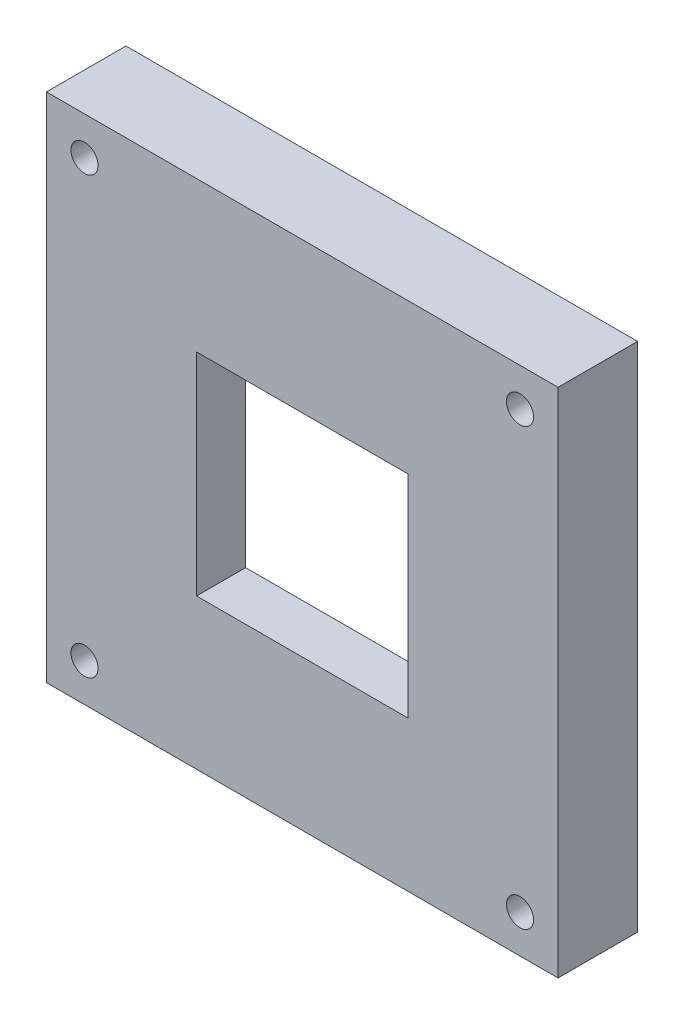
ISO-10303-21;
HEADER;
FILE_DESCRIPTION(('STEP AP214'),'2;1');
FILE_NAME('part.step','',(''),(''),'','','');
FILE_SCHEMA(('AUTOMOTIVE_DESIGN { 1 0 10303 214 1 1 1 1 }'));
ENDSEC;
DATA;
#1=APPLICATION_CONTEXT('core data for automotive mechanical design processes');
#2=APPLICATION_PROTOCOL_DEFINITION('international standard','automotive_design',2000,#1);
#3=PRODUCT_CONTEXT('',#1,'mechanical');
#4=PRODUCT('Part','Part','',(#3));
#5=PRODUCT_RELATED_PRODUCT_CATEGORY('part','',(#4));
#6=PRODUCT_DEFINITION_FORMATION('','',#4);
#7=PRODUCT_DEFINITION_CONTEXT('part definition',#1,'design');
#8=PRODUCT_DEFINITION('design','',#6,#7);
#9=PRODUCT_DEFINITION_SHAPE('','',#8);
#10=(LENGTH_UNIT() NAMED_UNIT(*) SI_UNIT(.MILLI.,.METRE.));
#11=(NAMED_UNIT(*) PLANE_ANGLE_UNIT() SI_UNIT($,.RADIAN.));
#12=(NAMED_UNIT(*) SI_UNIT($,.STERADIAN.) SOLID_ANGLE_UNIT());
#13=UNCERTAINTY_MEASURE_WITH_UNIT(LENGTH_MEASURE(1.E-05),#10,'distance_accuracy_value','');
#14=(GEOMETRIC_REPRESENTATION_CONTEXT(3) GLOBAL_UNCERTAINTY_ASSIGNED_CONTEXT((#13)) GLOBAL_UNIT_ASSIGNED_CONTEXT((#10,
#11,#12)) REPRESENTATION_CONTEXT('',''));
#15=CARTESIAN_POINT('',(0.,0.,0.));
#16=DIRECTION('',(0.,0.,1.));
#17=DIRECTION('',(1.,0.,0.));
#18=AXIS2_PLACEMENT_3D('',#15,#16,#17);
#19=CARTESIAN_POINT('',(0.,0.,-2.4));
#20=DIRECTION('',(0.,0.,-1.));
#21=DIRECTION('',(-1.,0.,0.));
#22=AXIS2_PLACEMENT_3D('',#19,#20,#21);
#23=PLANE('',#22);
#24=DIRECTION('',(0.,1.,0.));
#25=VECTOR('',#24,1.);
#26=CARTESIAN_POINT('',(19.25,-19.25,-2.4));
#27=LINE('',#26,#25);
#28=CARTESIAN_POINT('',(19.25,-19.25,-2.4));
#29=VERTEX_POINT('',#28);
#30=CARTESIAN_POINT('',(19.25,19.25,-2.4));
#31=VERTEX_POINT('',#30);
#32=EDGE_CURVE('E401',#29,#31,#27,.T.);
#33=ORIENTED_EDGE('',*,*,#32,.T.);
#34=DIRECTION('',(-1.,0.,0.));
#35=VECTOR('',#34,1.);
#36=CARTESIAN_POINT('',(-19.25,19.25,-2.4));
#37=LINE('',#36,#35);
#38=CARTESIAN_POINT('',(-19.25,19.25,-2.4));
#39=VERTEX_POINT('',#38);
#40=EDGE_CURVE('E404',#31,#39,#37,.T.);
#41=ORIENTED_EDGE('',*,*,#40,.T.);
#42=DIRECTION('',(0.,-1.,0.));
#43=VECTOR('',#42,1.);
#44=CARTESIAN_POINT('',(-19.25,-19.25,-2.4));
#45=LINE('',#44,#43);
#46=CARTESIAN_POINT('',(-19.25,-19.25,-2.4));
#47=VERTEX_POINT('',#46);
#48=EDGE_CURVE('E407',#39,#47,#45,.T.);
#49=ORIENTED_EDGE('',*,*,#48,.T.);
#50=DIRECTION('',(1.,0.,0.));
#51=VECTOR('',#50,1.);
#52=CARTESIAN_POINT('',(-19.25,-19.25,-2.4));
#53=LINE('',#52,#51);
#54=EDGE_CURVE('E410',#47,#29,#53,.T.);
#55=ORIENTED_EDGE('',*,*,#54,.T.);
#56=EDGE_LOOP('',(#33,#41,#49,#55));
#57=FACE_BOUND('',#56,.T.);
#58=DIRECTION('',(0.,1.,0.));
#59=VECTOR('',#58,1.);
#60=CARTESIAN_POINT('',(20.75,0.,-2.4));
#61=LINE('',#60,#59);
#62=CARTESIAN_POINT('',(20.75,-19.25,-2.4));
#63=VERTEX_POINT('',#62);
#64=CARTESIAN_POINT('',(20.75,19.25,-2.4));
#65=VERTEX_POINT('',#64);
#66=EDGE_CURVE('E58',#63,#65,#61,.T.);
#67=ORIENTED_EDGE('',*,*,#66,.F.);
#68=CARTESIAN_POINT('',(19.25,-19.25,-2.4));
#69=DIRECTION('',(0.,0.,-1.));
#70=DIRECTION('',(-1.,0.,0.));
#71=AXIS2_PLACEMENT_3D('',#68,#69,#70);
#72=CIRCLE('',#71,1.5);
#73=CARTESIAN_POINT('',(19.25,-20.75,-2.4));
#74=VERTEX_POINT('',#73);
#75=EDGE_CURVE('E242',#74,#63,#72,.F.);
#76=ORIENTED_EDGE('',*,*,#75,.F.);
#77=DIRECTION('',(1.,0.,0.));
#78=VECTOR('',#77,1.);
#79=CARTESIAN_POINT('',(0.,-20.75,-2.4));
#80=LINE('',#79,#78);
#81=CARTESIAN_POINT('',(-19.25,-20.75,-2.4));
#82=VERTEX_POINT('',#81);
#83=EDGE_CURVE('E245',#82,#74,#80,.T.);
#84=ORIENTED_EDGE('',*,*,#83,.F.);
#85=CARTESIAN_POINT('',(-19.25,-19.25,-2.4));
#86=DIRECTION('',(0.,0.,-1.));
#87=DIRECTION('',(-1.,0.,0.));
#88=AXIS2_PLACEMENT_3D('',#85,#86,#87);
#89=CIRCLE('',#88,1.5);
#90=CARTESIAN_POINT('',(-20.75,-19.25,-2.4));
#91=VERTEX_POINT('',#90);
#92=EDGE_CURVE('E318',#91,#82,#89,.F.);
#93=ORIENTED_EDGE('',*,*,#92,.F.);
#94=DIRECTION('',(0.,-1.,0.));
#95=VECTOR('',#94,1.);
#96=CARTESIAN_POINT('',(-20.75,0.,-2.4));
#97=LINE('',#96,#95);
#98=CARTESIAN_POINT('',(-20.75,19.25,-2.4));
#99=VERTEX_POINT('',#98);
#100=EDGE_CURVE('E315',#99,#91,#97,.T.);
#101=ORIENTED_EDGE('',*,*,#100,.F.);
#102=CARTESIAN_POINT('',(-19.25,19.25,-2.4));
#103=DIRECTION('',(0.,0.,-1.));
#104=DIRECTION('',(-1.,0.,0.));
#105=AXIS2_PLACEMENT_3D('',#102,#103,#104);
#106=CIRCLE('',#105,1.5);
#107=CARTESIAN_POINT('',(-19.25,20.75,-2.4));
#108=VERTEX_POINT('',#107);
#109=EDGE_CURVE('E312',#108,#99,#106,.F.);
#110=ORIENTED_EDGE('',*,*,#109,.F.);
#111=DIRECTION('',(-1.,0.,0.));
#112=VECTOR('',#111,1.);
#113=CARTESIAN_POINT('',(0.,20.75,-2.4));
#114=LINE('',#113,#112);
#115=CARTESIAN_POINT('',(19.25,20.75,-2.4));
#116=VERTEX_POINT('',#115);
#117=EDGE_CURVE('E309',#116,#108,#114,.T.);
#118=ORIENTED_EDGE('',*,*,#117,.F.);
#119=CARTESIAN_POINT('',(19.25,19.25,-2.4));
#120=DIRECTION('',(0.,0.,-1.));
#121=DIRECTION('',(-1.,0.,0.));
#122=AXIS2_PLACEMENT_3D('',#119,#120,#121);
#123=CIRCLE('',#122,1.5);
#124=EDGE_CURVE('E306',#65,#116,#123,.F.);
#125=ORIENTED_EDGE('',*,*,#124,.F.);
#126=EDGE_LOOP('',(#67,#76,#84,#93,#101,#110,#118,#125));
#127=FACE_BOUND('',#126,.T.);
#128=ADVANCED_FACE('F33',(#57,#127),#23,.T.);
#129=CARTESIAN_POINT('',(19.25,-19.25,-2.4));
#130=DIRECTION('',(1.,0.,0.));
#131=DIRECTION('',(0.,0.,-1.));
#132=AXIS2_PLACEMENT_3D('',#129,#130,#131);
#133=PLANE('',#132);
#134=DIRECTION('',(0.,1.,0.));
#135=VECTOR('',#134,1.);
#136=CARTESIAN_POINT('',(19.25,-19.25,1.2));
#137=LINE('',#136,#135);
#138=CARTESIAN_POINT('',(19.25,-19.25,1.2));
#139=VERTEX_POINT('',#138);
#140=CARTESIAN_POINT('',(19.25,19.25,1.2));
#141=VERTEX_POINT('',#140);
#142=EDGE_CURVE('E353',#139,#141,#137,.T.);
#143=ORIENTED_EDGE('',*,*,#142,.T.);
#144=DIRECTION('',(0.,0.,1.));
#145=VECTOR('',#144,1.);
#146=CARTESIAN_POINT('',(19.25,19.25,-2.4));
#147=LINE('',#146,#145);
#148=EDGE_CURVE('E413',#31,#141,#147,.T.);
#149=ORIENTED_EDGE('',*,*,#148,.F.);
#150=ORIENTED_EDGE('',*,*,#32,.F.);
#151=DIRECTION('',(0.,0.,1.));
#152=VECTOR('',#151,1.);
#153=CARTESIAN_POINT('',(19.25,-19.25,-2.4));
#154=LINE('',#153,#152);
#155=EDGE_CURVE('E414',#29,#139,#154,.T.);
#156=ORIENTED_EDGE('',*,*,#155,.T.);
#157=EDGE_LOOP('',(#143,#149,#150,#156));
#158=FACE_BOUND('',#157,.T.);
#159=ADVANCED_FACE('F465',(#158),#133,.F.);
#160=CARTESIAN_POINT('',(-19.25,-19.25,-2.4));
#161=DIRECTION('',(0.,-1.,0.));
#162=DIRECTION('',(0.,0.,-1.));
#163=AXIS2_PLACEMENT_3D('',#160,#161,#162);
#164=PLANE('',#163);
#165=DIRECTION('',(1.,0.,0.));
#166=VECTOR('',#165,1.);
#167=CARTESIAN_POINT('',(-19.25,-19.25,1.2));
#168=LINE('',#167,#166);
#169=CARTESIAN_POINT('',(-19.25,-19.25,1.2));
#170=VERTEX_POINT('',#169);
#171=EDGE_CURVE('E357',#170,#139,#168,.T.);
#172=ORIENTED_EDGE('',*,*,#171,.T.);
#173=ORIENTED_EDGE('',*,*,#155,.F.);
#174=ORIENTED_EDGE('',*,*,#54,.F.);
#175=DIRECTION('',(0.,0.,1.));
#176=VECTOR('',#175,1.);
#177=CARTESIAN_POINT('',(-19.25,-19.25,-2.4));
#178=LINE('',#177,#176);
#179=EDGE_CURVE('E418',#47,#170,#178,.T.);
#180=ORIENTED_EDGE('',*,*,#179,.T.);
#181=EDGE_LOOP('',(#172,#173,#174,#180));
#182=FACE_BOUND('',#181,.T.);
#183=ADVANCED_FACE('F471',(#182),#164,.F.);
#184=CARTESIAN_POINT('',(-19.25,-19.25,-2.4));
#185=DIRECTION('',(-1.,0.,0.));
#186=DIRECTION('',(0.,0.,1.));
#187=AXIS2_PLACEMENT_3D('',#184,#185,#186);
#188=PLANE('',#187);
#189=DIRECTION('',(0.,-1.,0.));
#190=VECTOR('',#189,1.);
#191=CARTESIAN_POINT('',(-19.25,19.25,1.2));
#192=LINE('',#191,#190);
#193=CARTESIAN_POINT('',(-19.25,19.25,1.2));
#194=VERTEX_POINT('',#193);
#195=EDGE_CURVE('E359',#194,#170,#192,.T.);
#196=ORIENTED_EDGE('',*,*,#195,.T.);
#197=ORIENTED_EDGE('',*,*,#179,.F.);
#198=ORIENTED_EDGE('',*,*,#48,.F.);
#199=DIRECTION('',(0.,0.,1.));
#200=VECTOR('',#199,1.);
#201=CARTESIAN_POINT('',(-19.25,19.25,-2.4));
#202=LINE('',#201,#200);
#203=EDGE_CURVE('E421',#39,#194,#202,.T.);
#204=ORIENTED_EDGE('',*,*,#203,.T.);
#205=EDGE_LOOP('',(#196,#197,#198,#204));
#206=FACE_BOUND('',#205,.T.);
#207=ADVANCED_FACE('F568',(#206),#188,.F.);
#208=CARTESIAN_POINT('',(-19.25,19.25,-2.4));
#209=DIRECTION('',(0.,1.,0.));
#210=DIRECTION('',(0.,0.,1.));
#211=AXIS2_PLACEMENT_3D('',#208,#209,#210);
#212=PLANE('',#211);
#213=DIRECTION('',(-1.,0.,0.));
#214=VECTOR('',#213,1.);
#215=CARTESIAN_POINT('',(19.25,19.25,1.2));
#216=LINE('',#215,#214);
#217=EDGE_CURVE('E361',#141,#194,#216,.T.);
#218=ORIENTED_EDGE('',*,*,#217,.T.);
#219=ORIENTED_EDGE('',*,*,#203,.F.);
#220=ORIENTED_EDGE('',*,*,#40,.F.);
#221=ORIENTED_EDGE('',*,*,#148,.T.);
#222=EDGE_LOOP('',(#218,#219,#220,#221));
#223=FACE_BOUND('',#222,.T.);
#224=ADVANCED_FACE('F572',(#223),#212,.F.);
#225=CARTESIAN_POINT('',(-30.25,-30.25,-2.4));
#226=DIRECTION('',(-1.,0.,0.));
#227=DIRECTION('',(0.,0.,1.));
#228=AXIS2_PLACEMENT_3D('',#225,#226,#227);
#229=PLANE('',#228);
#230=DIRECTION('',(0.,0.,1.));
#231=VECTOR('',#230,1.);
#232=CARTESIAN_POINT('',(-30.25,-30.25,-2.4));
#233=LINE('',#232,#231);
#234=CARTESIAN_POINT('',(-30.25,-30.25,-2.4));
#235=VERTEX_POINT('',#234);
#236=CARTESIAN_POINT('',(-30.25,-30.25,7.));
#237=VERTEX_POINT('',#236);
#238=EDGE_CURVE('E37',#235,#237,#233,.T.);
#239=ORIENTED_EDGE('',*,*,#238,.T.);
#240=DIRECTION('',(0.,-1.,0.));
#241=VECTOR('',#240,1.);
#242=CARTESIAN_POINT('',(-30.25,-30.25,7.));
#243=LINE('',#242,#241);
#244=CARTESIAN_POINT('',(-30.25,30.25,7.));
#245=VERTEX_POINT('',#244);
#246=EDGE_CURVE('E388',#245,#237,#243,.T.);
#247=ORIENTED_EDGE('',*,*,#246,.F.);
#248=DIRECTION('',(0.,0.,1.));
#249=VECTOR('',#248,1.);
#250=CARTESIAN_POINT('',(-30.25,30.25,-2.4));
#251=LINE('',#250,#249);
#252=CARTESIAN_POINT('',(-30.25,30.25,-2.4));
#253=VERTEX_POINT('',#252);
#254=EDGE_CURVE('E11',#253,#245,#251,.T.);
#255=ORIENTED_EDGE('',*,*,#254,.F.);
#256=DIRECTION('',(0.,-1.,0.));
#257=VECTOR('',#256,1.);
#258=CARTESIAN_POINT('',(-30.25,-30.25,-2.4));
#259=LINE('',#258,#257);
#260=EDGE_CURVE('E417',#253,#235,#259,.T.);
#261=ORIENTED_EDGE('',*,*,#260,.T.);
#262=EDGE_LOOP('',(#239,#247,#255,#261));
#263=FACE_BOUND('',#262,.T.);
#264=ADVANCED_FACE('F35',(#263),#229,.T.);
#265=CARTESIAN_POINT('',(-30.25,30.25,-2.4));
#266=DIRECTION('',(0.,1.,0.));
#267=DIRECTION('',(-1.,0.,0.));
#268=AXIS2_PLACEMENT_3D('',#265,#266,#267);
#269=PLANE('',#268);
#270=ORIENTED_EDGE('',*,*,#254,.T.);
#271=DIRECTION('',(-1.,0.,0.));
#272=VECTOR('',#271,1.);
#273=CARTESIAN_POINT('',(-30.25,30.25,7.));
#274=LINE('',#273,#272);
#275=CARTESIAN_POINT('',(30.25,30.25,7.));
#276=VERTEX_POINT('',#275);
#277=EDGE_CURVE('E398',#276,#245,#274,.T.);
#278=ORIENTED_EDGE('',*,*,#277,.F.);
#279=DIRECTION('',(0.,0.,1.));
#280=VECTOR('',#279,1.);
#281=CARTESIAN_POINT('',(30.25,30.25,-2.4));
#282=LINE('',#281,#280);
#283=CARTESIAN_POINT('',(30.25,30.25,-2.4));
#284=VERTEX_POINT('',#283);
#285=EDGE_CURVE('E42',#284,#276,#282,.T.);
#286=ORIENTED_EDGE('',*,*,#285,.F.);
#287=DIRECTION('',(-1.,0.,0.));
#288=VECTOR('',#287,1.);
#289=CARTESIAN_POINT('',(-30.25,30.25,-2.4));
#290=LINE('',#289,#288);
#291=EDGE_CURVE('E433',#284,#253,#290,.T.);
#292=ORIENTED_EDGE('',*,*,#291,.T.);
#293=EDGE_LOOP('',(#270,#278,#286,#292));
#294=FACE_BOUND('',#293,.T.);
#295=ADVANCED_FACE('F450',(#294),#269,.T.);
#296=CARTESIAN_POINT('',(30.25,-30.25,-2.4));
#297=DIRECTION('',(1.,0.,0.));
#298=DIRECTION('',(0.,1.,0.));
#299=AXIS2_PLACEMENT_3D('',#296,#297,#298);
#300=PLANE('',#299);
#301=ORIENTED_EDGE('',*,*,#285,.T.);
#302=DIRECTION('',(0.,1.,0.));
#303=VECTOR('',#302,1.);
#304=CARTESIAN_POINT('',(30.25,-30.25,7.));
#305=LINE('',#304,#303);
#306=CARTESIAN_POINT('',(30.25,-30.25,7.));
#307=VERTEX_POINT('',#306);
#308=EDGE_CURVE('E395',#307,#276,#305,.T.);
#309=ORIENTED_EDGE('',*,*,#308,.F.);
#310=DIRECTION('',(0.,0.,1.));
#311=VECTOR('',#310,1.);
#312=CARTESIAN_POINT('',(30.25,-30.25,-2.4));
#313=LINE('',#312,#311);
#314=CARTESIAN_POINT('',(30.25,-30.25,-2.4));
#315=VERTEX_POINT('',#314);
#316=EDGE_CURVE('E436',#315,#307,#313,.T.);
#317=ORIENTED_EDGE('',*,*,#316,.F.);
#318=DIRECTION('',(0.,1.,0.));
#319=VECTOR('',#318,1.);
#320=CARTESIAN_POINT('',(30.25,-30.25,-2.4));
#321=LINE('',#320,#319);
#322=EDGE_CURVE('E430',#315,#284,#321,.T.);
#323=ORIENTED_EDGE('',*,*,#322,.T.);
#324=EDGE_LOOP('',(#301,#309,#317,#323));
#325=FACE_BOUND('',#324,.T.);
#326=ADVANCED_FACE('F456',(#325),#300,.T.);
#327=CARTESIAN_POINT('',(-30.25,-30.25,-2.4));
#328=DIRECTION('',(0.,-1.,0.));
#329=DIRECTION('',(0.,0.,-1.));
#330=AXIS2_PLACEMENT_3D('',#327,#328,#329);
#331=PLANE('',#330);
#332=ORIENTED_EDGE('',*,*,#316,.T.);
#333=DIRECTION('',(1.,0.,0.));
#334=VECTOR('',#333,1.);
#335=CARTESIAN_POINT('',(-30.25,-30.25,7.));
#336=LINE('',#335,#334);
#337=EDGE_CURVE('E392',#237,#307,#336,.T.);
#338=ORIENTED_EDGE('',*,*,#337,.F.);
#339=ORIENTED_EDGE('',*,*,#238,.F.);
#340=DIRECTION('',(1.,0.,0.));
#341=VECTOR('',#340,1.);
#342=CARTESIAN_POINT('',(-30.25,-30.25,-2.4));
#343=LINE('',#342,#341);
#344=EDGE_CURVE('E427',#235,#315,#343,.T.);
#345=ORIENTED_EDGE('',*,*,#344,.T.);
#346=EDGE_LOOP('',(#332,#338,#339,#345));
#347=FACE_BOUND('',#346,.T.);
#348=ADVANCED_FACE('F443',(#347),#331,.T.);
#349=CARTESIAN_POINT('',(25.75,-25.75,-2.4));
#350=DIRECTION('',(0.,0.,-1.));
#351=DIRECTION('',(-1.,0.,0.));
#352=AXIS2_PLACEMENT_3D('',#349,#350,#351);
#353=CIRCLE('',#352,1.6);
#354=CARTESIAN_POINT('',(24.15,-25.75,-2.4));
#355=VERTEX_POINT('',#354);
#356=EDGE_CURVE('E248',#355,#355,#353,.T.);
#357=ORIENTED_EDGE('',*,*,#356,.F.);
#358=EDGE_LOOP('',(#357));
#359=FACE_BOUND('',#358,.T.);
#360=CARTESIAN_POINT('',(-25.75,-25.75,-2.4));
#361=DIRECTION('',(0.,0.,-1.));
#362=DIRECTION('',(-1.,0.,0.));
#363=AXIS2_PLACEMENT_3D('',#360,#361,#362);
#364=CIRCLE('',#363,1.6);
#365=CARTESIAN_POINT('',(-27.35,-25.75,-2.4));
#366=VERTEX_POINT('',#365);
#367=EDGE_CURVE('E489',#366,#366,#364,.T.);
#368=ORIENTED_EDGE('',*,*,#367,.F.);
#369=EDGE_LOOP('',(#368));
#370=FACE_BOUND('',#369,.T.);
#371=CARTESIAN_POINT('',(-25.75,25.75,-2.4));
#372=DIRECTION('',(0.,0.,-1.));
#373=DIRECTION('',(-1.,0.,0.));
#374=AXIS2_PLACEMENT_3D('',#371,#372,#373);
#375=CIRCLE('',#374,1.6);
#376=CARTESIAN_POINT('',(-27.35,25.75,-2.4));
#377=VERTEX_POINT('',#376);
#378=EDGE_CURVE('E493',#377,#377,#375,.T.);
#379=ORIENTED_EDGE('',*,*,#378,.F.);
#380=EDGE_LOOP('',(#379));
#381=FACE_BOUND('',#380,.T.);
#382=CARTESIAN_POINT('',(25.75,25.75,-2.4));
#383=DIRECTION('',(0.,0.,-1.));
#384=DIRECTION('',(-1.,0.,0.));
#385=AXIS2_PLACEMENT_3D('',#382,#383,#384);
#386=CIRCLE('',#385,1.6);
#387=CARTESIAN_POINT('',(24.15,25.75,-2.4));
#388=VERTEX_POINT('',#387);
#389=EDGE_CURVE('E497',#388,#388,#386,.T.);
#390=ORIENTED_EDGE('',*,*,#389,.F.);
#391=EDGE_LOOP('',(#390));
#392=FACE_BOUND('',#391,.T.);
#393=DIRECTION('',(0.,1.,0.));
#394=VECTOR('',#393,1.);
#395=CARTESIAN_POINT('',(24.95,0.,-2.4));
#396=LINE('',#395,#394);
#397=CARTESIAN_POINT('',(24.95,-19.25,-2.4));
#398=VERTEX_POINT('',#397);
#399=CARTESIAN_POINT('',(24.95,19.25,-2.4));
#400=VERTEX_POINT('',#399);
#401=EDGE_CURVE('E285',#398,#400,#396,.T.);
#402=ORIENTED_EDGE('',*,*,#401,.T.);
#403=CARTESIAN_POINT('',(19.25,19.25,-2.4));
#404=DIRECTION('',(0.,0.,-1.));
#405=DIRECTION('',(-1.,0.,0.));
#406=AXIS2_PLACEMENT_3D('',#403,#404,#405);
#407=CIRCLE('',#406,5.70000000000001);
#408=CARTESIAN_POINT('',(19.25,24.95,-2.4));
#409=VERTEX_POINT('',#408);
#410=EDGE_CURVE('E50',#400,#409,#407,.F.);
#411=ORIENTED_EDGE('',*,*,#410,.T.);
#412=DIRECTION('',(-1.,0.,0.));
#413=VECTOR('',#412,1.);
#414=CARTESIAN_POINT('',(0.,24.95,-2.4));
#415=LINE('',#414,#413);
#416=CARTESIAN_POINT('',(-19.25,24.95,-2.4));
#417=VERTEX_POINT('',#416);
#418=EDGE_CURVE('E302',#409,#417,#415,.T.);
#419=ORIENTED_EDGE('',*,*,#418,.T.);
#420=CARTESIAN_POINT('',(-19.25,19.25,-2.4));
#421=DIRECTION('',(0.,0.,-1.));
#422=DIRECTION('',(-1.,0.,0.));
#423=AXIS2_PLACEMENT_3D('',#420,#421,#422);
#424=CIRCLE('',#423,5.7);
#425=CARTESIAN_POINT('',(-24.95,19.25,-2.4));
#426=VERTEX_POINT('',#425);
#427=EDGE_CURVE('E299',#417,#426,#424,.F.);
#428=ORIENTED_EDGE('',*,*,#427,.T.);
#429=DIRECTION('',(0.,-1.,0.));
#430=VECTOR('',#429,1.);
#431=CARTESIAN_POINT('',(-24.95,0.,-2.4));
#432=LINE('',#431,#430);
#433=CARTESIAN_POINT('',(-24.95,-19.25,-2.4));
#434=VERTEX_POINT('',#433);
#435=EDGE_CURVE('E296',#426,#434,#432,.T.);
#436=ORIENTED_EDGE('',*,*,#435,.T.);
#437=CARTESIAN_POINT('',(-19.25,-19.25,-2.4));
#438=DIRECTION('',(0.,0.,-1.));
#439=DIRECTION('',(-1.,0.,0.));
#440=AXIS2_PLACEMENT_3D('',#437,#438,#439);
#441=CIRCLE('',#440,5.7);
#442=CARTESIAN_POINT('',(-19.25,-24.95,-2.4));
#443=VERTEX_POINT('',#442);
#444=EDGE_CURVE('E293',#434,#443,#441,.F.);
#445=ORIENTED_EDGE('',*,*,#444,.T.);
#446=DIRECTION('',(1.,0.,0.));
#447=VECTOR('',#446,1.);
#448=CARTESIAN_POINT('',(0.,-24.95,-2.4));
#449=LINE('',#448,#447);
#450=CARTESIAN_POINT('',(19.25,-24.95,-2.4));
#451=VERTEX_POINT('',#450);
#452=EDGE_CURVE('E290',#443,#451,#449,.T.);
#453=ORIENTED_EDGE('',*,*,#452,.T.);
#454=CARTESIAN_POINT('',(19.25,-19.25,-2.4));
#455=DIRECTION('',(0.,0.,-1.));
#456=DIRECTION('',(-1.,0.,0.));
#457=AXIS2_PLACEMENT_3D('',#454,#455,#456);
#458=CIRCLE('',#457,5.7);
#459=EDGE_CURVE('E287',#451,#398,#458,.F.);
#460=ORIENTED_EDGE('',*,*,#459,.T.);
#461=EDGE_LOOP('',(#402,#411,#419,#428,#436,#445,#453,#460));
#462=FACE_BOUND('',#461,.T.);
#463=ORIENTED_EDGE('',*,*,#260,.F.);
#464=ORIENTED_EDGE('',*,*,#291,.F.);
#465=ORIENTED_EDGE('',*,*,#322,.F.);
#466=ORIENTED_EDGE('',*,*,#344,.F.);
#467=EDGE_LOOP('',(#463,#464,#465,#466));
#468=FACE_BOUND('',#467,.T.);
#469=ADVANCED_FACE('F453',(#359,#370,#381,#392,#462,#468),#23,.T.);
#470=CARTESIAN_POINT('',(0.,0.,7.));
#471=DIRECTION('',(0.,0.,-1.));
#472=DIRECTION('',(-1.,0.,0.));
#473=AXIS2_PLACEMENT_3D('',#470,#471,#472);
#474=PLANE('',#473);
#475=CARTESIAN_POINT('',(25.75,-25.75,7.));
#476=DIRECTION('',(0.,0.,-1.));
#477=DIRECTION('',(-1.,0.,0.));
#478=AXIS2_PLACEMENT_3D('',#475,#476,#477);
#479=CIRCLE('',#478,1.6);
#480=CARTESIAN_POINT('',(24.15,-25.75,7.));
#481=VERTEX_POINT('',#480);
#482=EDGE_CURVE('E858',#481,#481,#479,.T.);
#483=ORIENTED_EDGE('',*,*,#482,.T.);
#484=EDGE_LOOP('',(#483));
#485=FACE_BOUND('',#484,.T.);
#486=CARTESIAN_POINT('',(-25.75,-25.75,7.));
#487=DIRECTION('',(0.,0.,-1.));
#488=DIRECTION('',(-1.,0.,0.));
#489=AXIS2_PLACEMENT_3D('',#486,#487,#488);
#490=CIRCLE('',#489,1.6);
#491=CARTESIAN_POINT('',(-27.35,-25.75,7.));
#492=VERTEX_POINT('',#491);
#493=EDGE_CURVE('E859',#492,#492,#490,.T.);
#494=ORIENTED_EDGE('',*,*,#493,.T.);
#495=EDGE_LOOP('',(#494));
#496=FACE_BOUND('',#495,.T.);
#497=CARTESIAN_POINT('',(-25.75,25.75,7.));
#498=DIRECTION('',(0.,0.,-1.));
#499=DIRECTION('',(-1.,0.,0.));
#500=AXIS2_PLACEMENT_3D('',#497,#498,#499);
#501=CIRCLE('',#500,1.6);
#502=CARTESIAN_POINT('',(-27.35,25.75,7.));
#503=VERTEX_POINT('',#502);
#504=EDGE_CURVE('E862',#503,#503,#501,.T.);
#505=ORIENTED_EDGE('',*,*,#504,.T.);
#506=EDGE_LOOP('',(#505));
#507=FACE_BOUND('',#506,.T.);
#508=CARTESIAN_POINT('',(25.75,25.75,7.));
#509=DIRECTION('',(0.,0.,-1.));
#510=DIRECTION('',(-1.,0.,0.));
#511=AXIS2_PLACEMENT_3D('',#508,#509,#510);
#512=CIRCLE('',#511,1.6);
#513=CARTESIAN_POINT('',(24.15,25.75,7.));
#514=VERTEX_POINT('',#513);
#515=EDGE_CURVE('E866',#514,#514,#512,.T.);
#516=ORIENTED_EDGE('',*,*,#515,.T.);
#517=EDGE_LOOP('',(#516));
#518=FACE_BOUND('',#517,.T.);
#519=ORIENTED_EDGE('',*,*,#246,.T.);
#520=ORIENTED_EDGE('',*,*,#337,.T.);
#521=ORIENTED_EDGE('',*,*,#308,.T.);
#522=ORIENTED_EDGE('',*,*,#277,.T.);
#523=EDGE_LOOP('',(#519,#520,#521,#522));
#524=FACE_BOUND('',#523,.T.);
#525=DIRECTION('',(0.,-1.,0.));
#526=VECTOR('',#525,1.);
#527=CARTESIAN_POINT('',(12.5,-12.5,7.));
#528=LINE('',#527,#526);
#529=CARTESIAN_POINT('',(12.5,12.5,7.));
#530=VERTEX_POINT('',#529);
#531=CARTESIAN_POINT('',(12.5,-12.5,7.));
#532=VERTEX_POINT('',#531);
#533=EDGE_CURVE('E377',#530,#532,#528,.T.);
#534=ORIENTED_EDGE('',*,*,#533,.T.);
#535=DIRECTION('',(-1.,0.,0.));
#536=VECTOR('',#535,1.);
#537=CARTESIAN_POINT('',(-12.5,-12.5,7.));
#538=LINE('',#537,#536);
#539=CARTESIAN_POINT('',(-12.5,-12.5,7.));
#540=VERTEX_POINT('',#539);
#541=EDGE_CURVE('E374',#532,#540,#538,.T.);
#542=ORIENTED_EDGE('',*,*,#541,.T.);
#543=DIRECTION('',(0.,1.,0.));
#544=VECTOR('',#543,1.);
#545=CARTESIAN_POINT('',(-12.5,-12.5,7.));
#546=LINE('',#545,#544);
#547=CARTESIAN_POINT('',(-12.5,12.5,7.));
#548=VERTEX_POINT('',#547);
#549=EDGE_CURVE('E376',#540,#548,#546,.T.);
#550=ORIENTED_EDGE('',*,*,#549,.T.);
#551=DIRECTION('',(1.,0.,0.));
#552=VECTOR('',#551,1.);
#553=CARTESIAN_POINT('',(-12.5,12.5,7.));
#554=LINE('',#553,#552);
#555=EDGE_CURVE('E386',#548,#530,#554,.T.);
#556=ORIENTED_EDGE('',*,*,#555,.T.);
#557=EDGE_LOOP('',(#534,#542,#550,#556));
#558=FACE_BOUND('',#557,.T.);
#559=ADVANCED_FACE('F446',(#485,#496,#507,#518,#524,#558),#474,.F.);
#560=CARTESIAN_POINT('',(0.,0.,1.2));
#561=DIRECTION('',(0.,0.,1.));
#562=DIRECTION('',(1.,0.,0.));
#563=AXIS2_PLACEMENT_3D('',#560,#561,#562);
#564=PLANE('',#563);
#565=ORIENTED_EDGE('',*,*,#217,.F.);
#566=ORIENTED_EDGE('',*,*,#142,.F.);
#567=ORIENTED_EDGE('',*,*,#171,.F.);
#568=ORIENTED_EDGE('',*,*,#195,.F.);
#569=EDGE_LOOP('',(#565,#566,#567,#568));
#570=FACE_BOUND('',#569,.T.);
#571=DIRECTION('',(0.,1.,0.));
#572=VECTOR('',#571,1.);
#573=CARTESIAN_POINT('',(12.5,-12.5,1.2));
#574=LINE('',#573,#572);
#575=CARTESIAN_POINT('',(12.5,-12.5,1.2));
#576=VERTEX_POINT('',#575);
#577=CARTESIAN_POINT('',(12.5,12.5,1.2));
#578=VERTEX_POINT('',#577);
#579=EDGE_CURVE('E325',#576,#578,#574,.T.);
#580=ORIENTED_EDGE('',*,*,#579,.T.);
#581=DIRECTION('',(-1.,0.,0.));
#582=VECTOR('',#581,1.);
#583=CARTESIAN_POINT('',(-12.5,12.5,1.2));
#584=LINE('',#583,#582);
#585=CARTESIAN_POINT('',(-12.5,12.5,1.2));
#586=VERTEX_POINT('',#585);
#587=EDGE_CURVE('E369',#578,#586,#584,.T.);
#588=ORIENTED_EDGE('',*,*,#587,.T.);
#589=DIRECTION('',(0.,-1.,0.));
#590=VECTOR('',#589,1.);
#591=CARTESIAN_POINT('',(-12.5,-12.5,1.2));
#592=LINE('',#591,#590);
#593=CARTESIAN_POINT('',(-12.5,-12.5,1.2));
#594=VERTEX_POINT('',#593);
#595=EDGE_CURVE('E366',#586,#594,#592,.T.);
#596=ORIENTED_EDGE('',*,*,#595,.T.);
#597=DIRECTION('',(1.,0.,0.));
#598=VECTOR('',#597,1.);
#599=CARTESIAN_POINT('',(-12.5,-12.5,1.2));
#600=LINE('',#599,#598);
#601=EDGE_CURVE('E363',#594,#576,#600,.T.);
#602=ORIENTED_EDGE('',*,*,#601,.T.);
#603=EDGE_LOOP('',(#580,#588,#596,#602));
#604=FACE_BOUND('',#603,.T.);
#605=ADVANCED_FACE('F480',(#570,#604),#564,.F.);
#606=CARTESIAN_POINT('',(12.5,-12.5,61.4472221513642));
#607=DIRECTION('',(-1.,0.,0.));
#608=DIRECTION('',(0.,0.,1.));
#609=AXIS2_PLACEMENT_3D('',#606,#607,#608);
#610=PLANE('',#609);
#611=ORIENTED_EDGE('',*,*,#533,.F.);
#612=DIRECTION('',(0.,0.,-1.));
#613=VECTOR('',#612,1.);
#614=CARTESIAN_POINT('',(12.5,12.5,61.4472221513642));
#615=LINE('',#614,#613);
#616=EDGE_CURVE('E356',#530,#578,#615,.T.);
#617=ORIENTED_EDGE('',*,*,#616,.T.);
#618=ORIENTED_EDGE('',*,*,#579,.F.);
#619=DIRECTION('',(0.,0.,-1.));
#620=VECTOR('',#619,1.);
#621=CARTESIAN_POINT('',(12.5,-12.5,61.4472221513642));
#622=LINE('',#621,#620);
#623=EDGE_CURVE('E383',#532,#576,#622,.T.);
#624=ORIENTED_EDGE('',*,*,#623,.F.);
#625=EDGE_LOOP('',(#611,#617,#618,#624));
#626=FACE_BOUND('',#625,.T.);
#627=ADVANCED_FACE('F549',(#626),#610,.T.);
#628=CARTESIAN_POINT('',(-12.5,12.5,61.4472221513642));
#629=DIRECTION('',(0.,-1.,0.));
#630=DIRECTION('',(0.,0.,-1.));
#631=AXIS2_PLACEMENT_3D('',#628,#629,#630);
#632=PLANE('',#631);
#633=ORIENTED_EDGE('',*,*,#555,.F.);
#634=DIRECTION('',(0.,0.,-1.));
#635=VECTOR('',#634,1.);
#636=CARTESIAN_POINT('',(-12.5,12.5,61.4472221513642));
#637=LINE('',#636,#635);
#638=EDGE_CURVE('E379',#548,#586,#637,.T.);
#639=ORIENTED_EDGE('',*,*,#638,.T.);
#640=ORIENTED_EDGE('',*,*,#587,.F.);
#641=ORIENTED_EDGE('',*,*,#616,.F.);
#642=EDGE_LOOP('',(#633,#639,#640,#641));
#643=FACE_BOUND('',#642,.T.);
#644=ADVANCED_FACE('F558',(#643),#632,.T.);
#645=CARTESIAN_POINT('',(-12.5,-12.5,61.4472221513642));
#646=DIRECTION('',(1.,0.,0.));
#647=DIRECTION('',(0.,0.,-1.));
#648=AXIS2_PLACEMENT_3D('',#645,#646,#647);
#649=PLANE('',#648);
#650=ORIENTED_EDGE('',*,*,#549,.F.);
#651=DIRECTION('',(0.,0.,-1.));
#652=VECTOR('',#651,1.);
#653=CARTESIAN_POINT('',(-12.5,-12.5,61.4472221513642));
#654=LINE('',#653,#652);
#655=EDGE_CURVE('E381',#540,#594,#654,.T.);
#656=ORIENTED_EDGE('',*,*,#655,.T.);
#657=ORIENTED_EDGE('',*,*,#595,.F.);
#658=ORIENTED_EDGE('',*,*,#638,.F.);
#659=EDGE_LOOP('',(#650,#656,#657,#658));
#660=FACE_BOUND('',#659,.T.);
#661=ADVANCED_FACE('F554',(#660),#649,.T.);
#662=CARTESIAN_POINT('',(-12.5,-12.5,61.4472221513642));
#663=DIRECTION('',(0.,1.,0.));
#664=DIRECTION('',(0.,0.,1.));
#665=AXIS2_PLACEMENT_3D('',#662,#663,#664);
#666=PLANE('',#665);
#667=ORIENTED_EDGE('',*,*,#541,.F.);
#668=ORIENTED_EDGE('',*,*,#623,.T.);
#669=ORIENTED_EDGE('',*,*,#601,.F.);
#670=ORIENTED_EDGE('',*,*,#655,.F.);
#671=EDGE_LOOP('',(#667,#668,#669,#670));
#672=FACE_BOUND('',#671,.T.);
#673=ADVANCED_FACE('F551',(#672),#666,.T.);
#674=CARTESIAN_POINT('',(20.75,0.,0.));
#675=DIRECTION('',(-1.,0.,0.));
#676=DIRECTION('',(0.,-1.,0.));
#677=AXIS2_PLACEMENT_3D('',#674,#675,#676);
#678=PLANE('',#677);
#679=ORIENTED_EDGE('',*,*,#66,.T.);
#680=DIRECTION('',(0.,0.,-1.));
#681=VECTOR('',#680,1.);
#682=CARTESIAN_POINT('',(20.75,19.25,0.));
#683=LINE('',#682,#681);
#684=CARTESIAN_POINT('',(20.75,19.25,0.));
#685=VERTEX_POINT('',#684);
#686=EDGE_CURVE('E338',#685,#65,#683,.T.);
#687=ORIENTED_EDGE('',*,*,#686,.F.);
#688=DIRECTION('',(0.,1.,0.));
#689=VECTOR('',#688,1.);
#690=CARTESIAN_POINT('',(20.75,0.,0.));
#691=LINE('',#690,#689);
#692=CARTESIAN_POINT('',(20.75,-19.25,0.));
#693=VERTEX_POINT('',#692);
#694=EDGE_CURVE('E261',#693,#685,#691,.T.);
#695=ORIENTED_EDGE('',*,*,#694,.F.);
#696=DIRECTION('',(0.,0.,-1.));
#697=VECTOR('',#696,1.);
#698=CARTESIAN_POINT('',(20.75,-19.25,0.));
#699=LINE('',#698,#697);
#700=EDGE_CURVE('E323',#693,#63,#699,.T.);
#701=ORIENTED_EDGE('',*,*,#700,.T.);
#702=EDGE_LOOP('',(#679,#687,#695,#701));
#703=FACE_BOUND('',#702,.T.);
#704=ADVANCED_FACE('F533',(#703),#678,.F.);
#705=CARTESIAN_POINT('',(19.25,-19.25,0.));
#706=DIRECTION('',(0.,0.,-1.));
#707=DIRECTION('',(-1.,0.,0.));
#708=AXIS2_PLACEMENT_3D('',#705,#706,#707);
#709=CYLINDRICAL_SURFACE('',#708,1.5);
#710=ORIENTED_EDGE('',*,*,#75,.T.);
#711=ORIENTED_EDGE('',*,*,#700,.F.);
#712=CARTESIAN_POINT('',(19.25,-19.25,0.));
#713=DIRECTION('',(0.,0.,-1.));
#714=DIRECTION('',(-1.,0.,0.));
#715=AXIS2_PLACEMENT_3D('',#712,#713,#714);
#716=CIRCLE('',#715,1.5);
#717=CARTESIAN_POINT('',(19.25,-20.75,0.));
#718=VERTEX_POINT('',#717);
#719=EDGE_CURVE('E236',#718,#693,#716,.F.);
#720=ORIENTED_EDGE('',*,*,#719,.F.);
#721=DIRECTION('',(0.,0.,-1.));
#722=VECTOR('',#721,1.);
#723=CARTESIAN_POINT('',(19.25,-20.75,0.));
#724=LINE('',#723,#722);
#725=EDGE_CURVE('E326',#718,#74,#724,.T.);
#726=ORIENTED_EDGE('',*,*,#725,.T.);
#727=EDGE_LOOP('',(#710,#711,#720,#726));
#728=FACE_BOUND('',#727,.T.);
#729=ADVANCED_FACE('F684',(#728),#709,.T.);
#730=CARTESIAN_POINT('',(0.,-20.75,0.));
#731=DIRECTION('',(0.,1.,0.));
#732=DIRECTION('',(0.,0.,1.));
#733=AXIS2_PLACEMENT_3D('',#730,#731,#732);
#734=PLANE('',#733);
#735=ORIENTED_EDGE('',*,*,#83,.T.);
#736=ORIENTED_EDGE('',*,*,#725,.F.);
#737=DIRECTION('',(1.,0.,0.));
#738=VECTOR('',#737,1.);
#739=CARTESIAN_POINT('',(0.,-20.75,0.));
#740=LINE('',#739,#738);
#741=CARTESIAN_POINT('',(-19.25,-20.75,0.));
#742=VERTEX_POINT('',#741);
#743=EDGE_CURVE('E279',#742,#718,#740,.T.);
#744=ORIENTED_EDGE('',*,*,#743,.F.);
#745=DIRECTION('',(0.,0.,-1.));
#746=VECTOR('',#745,1.);
#747=CARTESIAN_POINT('',(-19.25,-20.75,0.));
#748=LINE('',#747,#746);
#749=EDGE_CURVE('E328',#742,#82,#748,.T.);
#750=ORIENTED_EDGE('',*,*,#749,.T.);
#751=EDGE_LOOP('',(#735,#736,#744,#750));
#752=FACE_BOUND('',#751,.T.);
#753=ADVANCED_FACE('F692',(#752),#734,.F.);
#754=CARTESIAN_POINT('',(-19.25,-19.25,0.));
#755=DIRECTION('',(0.,0.,-1.));
#756=DIRECTION('',(-1.,0.,0.));
#757=AXIS2_PLACEMENT_3D('',#754,#755,#756);
#758=CYLINDRICAL_SURFACE('',#757,1.5);
#759=ORIENTED_EDGE('',*,*,#92,.T.);
#760=ORIENTED_EDGE('',*,*,#749,.F.);
#761=CARTESIAN_POINT('',(-19.25,-19.25,0.));
#762=DIRECTION('',(0.,0.,-1.));
#763=DIRECTION('',(-1.,0.,0.));
#764=AXIS2_PLACEMENT_3D('',#761,#762,#763);
#765=CIRCLE('',#764,1.5);
#766=CARTESIAN_POINT('',(-20.75,-19.25,0.));
#767=VERTEX_POINT('',#766);
#768=EDGE_CURVE('E276',#767,#742,#765,.F.);
#769=ORIENTED_EDGE('',*,*,#768,.F.);
#770=DIRECTION('',(0.,0.,-1.));
#771=VECTOR('',#770,1.);
#772=CARTESIAN_POINT('',(-20.75,-19.25,0.));
#773=LINE('',#772,#771);
#774=EDGE_CURVE('E330',#767,#91,#773,.T.);
#775=ORIENTED_EDGE('',*,*,#774,.T.);
#776=EDGE_LOOP('',(#759,#760,#769,#775));
#777=FACE_BOUND('',#776,.T.);
#778=ADVANCED_FACE('F702',(#777),#758,.T.);
#779=CARTESIAN_POINT('',(-20.75,0.,0.));
#780=DIRECTION('',(1.,0.,0.));
#781=DIRECTION('',(0.,0.,-1.));
#782=AXIS2_PLACEMENT_3D('',#779,#780,#781);
#783=PLANE('',#782);
#784=ORIENTED_EDGE('',*,*,#100,.T.);
#785=ORIENTED_EDGE('',*,*,#774,.F.);
#786=DIRECTION('',(0.,-1.,0.));
#787=VECTOR('',#786,1.);
#788=CARTESIAN_POINT('',(-20.75,0.,0.));
#789=LINE('',#788,#787);
#790=CARTESIAN_POINT('',(-20.75,19.25,0.));
#791=VERTEX_POINT('',#790);
#792=EDGE_CURVE('E273',#791,#767,#789,.T.);
#793=ORIENTED_EDGE('',*,*,#792,.F.);
#794=DIRECTION('',(0.,0.,-1.));
#795=VECTOR('',#794,1.);
#796=CARTESIAN_POINT('',(-20.75,19.25,0.));
#797=LINE('',#796,#795);
#798=EDGE_CURVE('E332',#791,#99,#797,.T.);
#799=ORIENTED_EDGE('',*,*,#798,.T.);
#800=EDGE_LOOP('',(#784,#785,#793,#799));
#801=FACE_BOUND('',#800,.T.);
#802=ADVANCED_FACE('F712',(#801),#783,.F.);
#803=CARTESIAN_POINT('',(-19.25,19.25,0.));
#804=DIRECTION('',(0.,0.,-1.));
#805=DIRECTION('',(-1.,0.,0.));
#806=AXIS2_PLACEMENT_3D('',#803,#804,#805);
#807=CYLINDRICAL_SURFACE('',#806,1.5);
#808=ORIENTED_EDGE('',*,*,#109,.T.);
#809=ORIENTED_EDGE('',*,*,#798,.F.);
#810=CARTESIAN_POINT('',(-19.25,19.25,0.));
#811=DIRECTION('',(0.,0.,-1.));
#812=DIRECTION('',(-1.,0.,0.));
#813=AXIS2_PLACEMENT_3D('',#810,#811,#812);
#814=CIRCLE('',#813,1.5);
#815=CARTESIAN_POINT('',(-19.25,20.75,0.));
#816=VERTEX_POINT('',#815);
#817=EDGE_CURVE('E270',#816,#791,#814,.F.);
#818=ORIENTED_EDGE('',*,*,#817,.F.);
#819=DIRECTION('',(0.,0.,-1.));
#820=VECTOR('',#819,1.);
#821=CARTESIAN_POINT('',(-19.25,20.75,0.));
#822=LINE('',#821,#820);
#823=EDGE_CURVE('E334',#816,#108,#822,.T.);
#824=ORIENTED_EDGE('',*,*,#823,.T.);
#825=EDGE_LOOP('',(#808,#809,#818,#824));
#826=FACE_BOUND('',#825,.T.);
#827=ADVANCED_FACE('F722',(#826),#807,.T.);
#828=CARTESIAN_POINT('',(0.,20.75,0.));
#829=DIRECTION('',(0.,-1.,0.));
#830=DIRECTION('',(1.,0.,0.));
#831=AXIS2_PLACEMENT_3D('',#828,#829,#830);
#832=PLANE('',#831);
#833=ORIENTED_EDGE('',*,*,#117,.T.);
#834=ORIENTED_EDGE('',*,*,#823,.F.);
#835=DIRECTION('',(-1.,0.,0.));
#836=VECTOR('',#835,1.);
#837=CARTESIAN_POINT('',(0.,20.75,0.));
#838=LINE('',#837,#836);
#839=CARTESIAN_POINT('',(19.25,20.75,0.));
#840=VERTEX_POINT('',#839);
#841=EDGE_CURVE('E267',#840,#816,#838,.T.);
#842=ORIENTED_EDGE('',*,*,#841,.F.);
#843=DIRECTION('',(0.,0.,-1.));
#844=VECTOR('',#843,1.);
#845=CARTESIAN_POINT('',(19.25,20.75,0.));
#846=LINE('',#845,#844);
#847=EDGE_CURVE('E336',#840,#116,#846,.T.);
#848=ORIENTED_EDGE('',*,*,#847,.T.);
#849=EDGE_LOOP('',(#833,#834,#842,#848));
#850=FACE_BOUND('',#849,.T.);
#851=ADVANCED_FACE('F530',(#850),#832,.F.);
#852=CARTESIAN_POINT('',(19.25,19.25,0.));
#853=DIRECTION('',(0.,0.,-1.));
#854=DIRECTION('',(-1.,0.,0.));
#855=AXIS2_PLACEMENT_3D('',#852,#853,#854);
#856=CYLINDRICAL_SURFACE('',#855,5.70000000000001);
#857=ORIENTED_EDGE('',*,*,#410,.F.);
#858=DIRECTION('',(0.,0.,-1.));
#859=VECTOR('',#858,1.);
#860=CARTESIAN_POINT('',(24.95,19.25,0.));
#861=LINE('',#860,#859);
#862=CARTESIAN_POINT('',(24.95,19.25,0.));
#863=VERTEX_POINT('',#862);
#864=EDGE_CURVE('E224',#863,#400,#861,.T.);
#865=ORIENTED_EDGE('',*,*,#864,.F.);
#866=CARTESIAN_POINT('',(19.25,19.25,0.));
#867=DIRECTION('',(0.,0.,-1.));
#868=DIRECTION('',(-1.,0.,0.));
#869=AXIS2_PLACEMENT_3D('',#866,#867,#868);
#870=CIRCLE('',#869,5.70000000000001);
#871=CARTESIAN_POINT('',(19.25,24.95,0.));
#872=VERTEX_POINT('',#871);
#873=EDGE_CURVE('E231',#863,#872,#870,.F.);
#874=ORIENTED_EDGE('',*,*,#873,.T.);
#875=DIRECTION('',(0.,0.,-1.));
#876=VECTOR('',#875,1.);
#877=CARTESIAN_POINT('',(19.25,24.95,0.));
#878=LINE('',#877,#876);
#879=EDGE_CURVE('E340',#872,#409,#878,.T.);
#880=ORIENTED_EDGE('',*,*,#879,.T.);
#881=EDGE_LOOP('',(#857,#865,#874,#880));
#882=FACE_BOUND('',#881,.T.);
#883=ADVANCED_FACE('F234',(#882),#856,.F.);
#884=CARTESIAN_POINT('',(0.,24.95,0.));
#885=DIRECTION('',(0.,-1.,0.));
#886=DIRECTION('',(0.,0.,-1.));
#887=AXIS2_PLACEMENT_3D('',#884,#885,#886);
#888=PLANE('',#887);
#889=ORIENTED_EDGE('',*,*,#418,.F.);
#890=ORIENTED_EDGE('',*,*,#879,.F.);
#891=DIRECTION('',(-1.,0.,0.));
#892=VECTOR('',#891,1.);
#893=CARTESIAN_POINT('',(0.,24.95,0.));
#894=LINE('',#893,#892);
#895=CARTESIAN_POINT('',(-19.25,24.95,0.));
#896=VERTEX_POINT('',#895);
#897=EDGE_CURVE('E241',#872,#896,#894,.T.);
#898=ORIENTED_EDGE('',*,*,#897,.T.);
#899=DIRECTION('',(0.,0.,-1.));
#900=VECTOR('',#899,1.);
#901=CARTESIAN_POINT('',(-19.25,24.95,0.));
#902=LINE('',#901,#900);
#903=EDGE_CURVE('E342',#896,#417,#902,.T.);
#904=ORIENTED_EDGE('',*,*,#903,.T.);
#905=EDGE_LOOP('',(#889,#890,#898,#904));
#906=FACE_BOUND('',#905,.T.);
#907=ADVANCED_FACE('F522',(#906),#888,.T.);
#908=CARTESIAN_POINT('',(-19.25,19.25,0.));
#909=DIRECTION('',(0.,0.,-1.));
#910=DIRECTION('',(-1.,0.,0.));
#911=AXIS2_PLACEMENT_3D('',#908,#909,#910);
#912=CYLINDRICAL_SURFACE('',#911,5.7);
#913=ORIENTED_EDGE('',*,*,#427,.F.);
#914=ORIENTED_EDGE('',*,*,#903,.F.);
#915=CARTESIAN_POINT('',(-19.25,19.25,0.));
#916=DIRECTION('',(0.,0.,-1.));
#917=DIRECTION('',(-1.,0.,0.));
#918=AXIS2_PLACEMENT_3D('',#915,#916,#917);
#919=CIRCLE('',#918,5.7);
#920=CARTESIAN_POINT('',(-24.95,19.25,0.));
#921=VERTEX_POINT('',#920);
#922=EDGE_CURVE('E258',#896,#921,#919,.F.);
#923=ORIENTED_EDGE('',*,*,#922,.T.);
#924=DIRECTION('',(0.,0.,-1.));
#925=VECTOR('',#924,1.);
#926=CARTESIAN_POINT('',(-24.95,19.25,0.));
#927=LINE('',#926,#925);
#928=EDGE_CURVE('E344',#921,#426,#927,.T.);
#929=ORIENTED_EDGE('',*,*,#928,.T.);
#930=EDGE_LOOP('',(#913,#914,#923,#929));
#931=FACE_BOUND('',#930,.T.);
#932=ADVANCED_FACE('F520',(#931),#912,.F.);
#933=CARTESIAN_POINT('',(-24.95,0.,0.));
#934=DIRECTION('',(1.,0.,0.));
#935=DIRECTION('',(0.,0.,-1.));
#936=AXIS2_PLACEMENT_3D('',#933,#934,#935);
#937=PLANE('',#936);
#938=ORIENTED_EDGE('',*,*,#435,.F.);
#939=ORIENTED_EDGE('',*,*,#928,.F.);
#940=DIRECTION('',(0.,-1.,0.));
#941=VECTOR('',#940,1.);
#942=CARTESIAN_POINT('',(-24.95,0.,0.));
#943=LINE('',#942,#941);
#944=CARTESIAN_POINT('',(-24.95,-19.25,0.));
#945=VERTEX_POINT('',#944);
#946=EDGE_CURVE('E256',#921,#945,#943,.T.);
#947=ORIENTED_EDGE('',*,*,#946,.T.);
#948=DIRECTION('',(0.,0.,-1.));
#949=VECTOR('',#948,1.);
#950=CARTESIAN_POINT('',(-24.95,-19.25,0.));
#951=LINE('',#950,#949);
#952=EDGE_CURVE('E346',#945,#434,#951,.T.);
#953=ORIENTED_EDGE('',*,*,#952,.T.);
#954=EDGE_LOOP('',(#938,#939,#947,#953));
#955=FACE_BOUND('',#954,.T.);
#956=ADVANCED_FACE('F515',(#955),#937,.T.);
#957=CARTESIAN_POINT('',(-19.25,-19.25,0.));
#958=DIRECTION('',(0.,0.,-1.));
#959=DIRECTION('',(-1.,0.,0.));
#960=AXIS2_PLACEMENT_3D('',#957,#958,#959);
#961=CYLINDRICAL_SURFACE('',#960,5.7);
#962=ORIENTED_EDGE('',*,*,#444,.F.);
#963=ORIENTED_EDGE('',*,*,#952,.F.);
#964=CARTESIAN_POINT('',(-19.25,-19.25,0.));
#965=DIRECTION('',(0.,0.,-1.));
#966=DIRECTION('',(-1.,0.,0.));
#967=AXIS2_PLACEMENT_3D('',#964,#965,#966);
#968=CIRCLE('',#967,5.7);
#969=CARTESIAN_POINT('',(-19.25,-24.95,0.));
#970=VERTEX_POINT('',#969);
#971=EDGE_CURVE('E254',#945,#970,#968,.F.);
#972=ORIENTED_EDGE('',*,*,#971,.T.);
#973=DIRECTION('',(0.,0.,-1.));
#974=VECTOR('',#973,1.);
#975=CARTESIAN_POINT('',(-19.25,-24.95,0.));
#976=LINE('',#975,#974);
#977=EDGE_CURVE('E348',#970,#443,#976,.T.);
#978=ORIENTED_EDGE('',*,*,#977,.T.);
#979=EDGE_LOOP('',(#962,#963,#972,#978));
#980=FACE_BOUND('',#979,.T.);
#981=ADVANCED_FACE('F511',(#980),#961,.F.);
#982=CARTESIAN_POINT('',(0.,-24.95,0.));
#983=DIRECTION('',(0.,1.,0.));
#984=DIRECTION('',(-1.,0.,0.));
#985=AXIS2_PLACEMENT_3D('',#982,#983,#984);
#986=PLANE('',#985);
#987=ORIENTED_EDGE('',*,*,#452,.F.);
#988=ORIENTED_EDGE('',*,*,#977,.F.);
#989=DIRECTION('',(1.,0.,0.));
#990=VECTOR('',#989,1.);
#991=CARTESIAN_POINT('',(0.,-24.95,0.));
#992=LINE('',#991,#990);
#993=CARTESIAN_POINT('',(19.25,-24.95,0.));
#994=VERTEX_POINT('',#993);
#995=EDGE_CURVE('E252',#970,#994,#992,.T.);
#996=ORIENTED_EDGE('',*,*,#995,.T.);
#997=DIRECTION('',(0.,0.,-1.));
#998=VECTOR('',#997,1.);
#999=CARTESIAN_POINT('',(19.25,-24.95,0.));
#1000=LINE('',#999,#998);
#1001=EDGE_CURVE('E350',#994,#451,#1000,.T.);
#1002=ORIENTED_EDGE('',*,*,#1001,.T.);
#1003=EDGE_LOOP('',(#987,#988,#996,#1002));
#1004=FACE_BOUND('',#1003,.T.);
#1005=ADVANCED_FACE('F508',(#1004),#986,.T.);
#1006=CARTESIAN_POINT('',(19.25,-19.25,0.));
#1007=DIRECTION('',(0.,0.,-1.));
#1008=DIRECTION('',(-1.,0.,0.));
#1009=AXIS2_PLACEMENT_3D('',#1006,#1007,#1008);
#1010=CYLINDRICAL_SURFACE('',#1009,5.7);
#1011=ORIENTED_EDGE('',*,*,#459,.F.);
#1012=ORIENTED_EDGE('',*,*,#1001,.F.);
#1013=CARTESIAN_POINT('',(19.25,-19.25,0.));
#1014=DIRECTION('',(0.,0.,-1.));
#1015=DIRECTION('',(-1.,0.,0.));
#1016=AXIS2_PLACEMENT_3D('',#1013,#1014,#1015);
#1017=CIRCLE('',#1016,5.7);
#1018=CARTESIAN_POINT('',(24.95,-19.25,0.));
#1019=VERTEX_POINT('',#1018);
#1020=EDGE_CURVE('E230',#994,#1019,#1017,.F.);
#1021=ORIENTED_EDGE('',*,*,#1020,.T.);
#1022=DIRECTION('',(0.,0.,-1.));
#1023=VECTOR('',#1022,1.);
#1024=CARTESIAN_POINT('',(24.95,-19.25,0.));
#1025=LINE('',#1024,#1023);
#1026=EDGE_CURVE('E226',#1019,#398,#1025,.T.);
#1027=ORIENTED_EDGE('',*,*,#1026,.T.);
#1028=EDGE_LOOP('',(#1011,#1012,#1021,#1027));
#1029=FACE_BOUND('',#1028,.T.);
#1030=ADVANCED_FACE('F502',(#1029),#1010,.F.);
#1031=CARTESIAN_POINT('',(24.95,0.,0.));
#1032=DIRECTION('',(-1.,0.,0.));
#1033=DIRECTION('',(0.,-1.,0.));
#1034=AXIS2_PLACEMENT_3D('',#1031,#1032,#1033);
#1035=PLANE('',#1034);
#1036=ORIENTED_EDGE('',*,*,#401,.F.);
#1037=ORIENTED_EDGE('',*,*,#1026,.F.);
#1038=DIRECTION('',(0.,1.,0.));
#1039=VECTOR('',#1038,1.);
#1040=CARTESIAN_POINT('',(24.95,0.,0.));
#1041=LINE('',#1040,#1039);
#1042=EDGE_CURVE('E221',#1019,#863,#1041,.T.);
#1043=ORIENTED_EDGE('',*,*,#1042,.T.);
#1044=ORIENTED_EDGE('',*,*,#864,.T.);
#1045=EDGE_LOOP('',(#1036,#1037,#1043,#1044));
#1046=FACE_BOUND('',#1045,.T.);
#1047=ADVANCED_FACE('F223',(#1046),#1035,.T.);
#1048=CARTESIAN_POINT('',(19.25,19.25,0.));
#1049=DIRECTION('',(0.,0.,-1.));
#1050=DIRECTION('',(-1.,0.,0.));
#1051=AXIS2_PLACEMENT_3D('',#1048,#1049,#1050);
#1052=CYLINDRICAL_SURFACE('',#1051,1.5);
#1053=ORIENTED_EDGE('',*,*,#124,.T.);
#1054=ORIENTED_EDGE('',*,*,#847,.F.);
#1055=CARTESIAN_POINT('',(19.25,19.25,0.));
#1056=DIRECTION('',(0.,0.,-1.));
#1057=DIRECTION('',(-1.,0.,0.));
#1058=AXIS2_PLACEMENT_3D('',#1055,#1056,#1057);
#1059=CIRCLE('',#1058,1.5);
#1060=EDGE_CURVE('E264',#685,#840,#1059,.F.);
#1061=ORIENTED_EDGE('',*,*,#1060,.F.);
#1062=ORIENTED_EDGE('',*,*,#686,.T.);
#1063=EDGE_LOOP('',(#1053,#1054,#1061,#1062));
#1064=FACE_BOUND('',#1063,.T.);
#1065=ADVANCED_FACE('F545',(#1064),#1052,.T.);
#1066=CARTESIAN_POINT('',(0.,0.,0.));
#1067=DIRECTION('',(0.,0.,-1.));
#1068=DIRECTION('',(-1.,0.,0.));
#1069=AXIS2_PLACEMENT_3D('',#1066,#1067,#1068);
#1070=PLANE('',#1069);
#1071=ORIENTED_EDGE('',*,*,#873,.F.);
#1072=ORIENTED_EDGE('',*,*,#1042,.F.);
#1073=ORIENTED_EDGE('',*,*,#1020,.F.);
#1074=ORIENTED_EDGE('',*,*,#995,.F.);
#1075=ORIENTED_EDGE('',*,*,#971,.F.);
#1076=ORIENTED_EDGE('',*,*,#946,.F.);
#1077=ORIENTED_EDGE('',*,*,#922,.F.);
#1078=ORIENTED_EDGE('',*,*,#897,.F.);
#1079=EDGE_LOOP('',(#1071,#1072,#1073,#1074,#1075,#1076,#1077,#1078));
#1080=FACE_BOUND('',#1079,.T.);
#1081=ORIENTED_EDGE('',*,*,#694,.T.);
#1082=ORIENTED_EDGE('',*,*,#1060,.T.);
#1083=ORIENTED_EDGE('',*,*,#841,.T.);
#1084=ORIENTED_EDGE('',*,*,#817,.T.);
#1085=ORIENTED_EDGE('',*,*,#792,.T.);
#1086=ORIENTED_EDGE('',*,*,#768,.T.);
#1087=ORIENTED_EDGE('',*,*,#743,.T.);
#1088=ORIENTED_EDGE('',*,*,#719,.T.);
#1089=EDGE_LOOP('',(#1081,#1082,#1083,#1084,#1085,#1086,#1087,#1088));
#1090=FACE_BOUND('',#1089,.T.);
#1091=ADVANCED_FACE('F238',(#1080,#1090),#1070,.T.);
#1092=CARTESIAN_POINT('',(25.75,25.75,7.));
#1093=DIRECTION('',(0.,0.,-1.));
#1094=DIRECTION('',(-1.,0.,0.));
#1095=AXIS2_PLACEMENT_3D('',#1092,#1093,#1094);
#1096=CYLINDRICAL_SURFACE('',#1095,1.6);
#1097=ORIENTED_EDGE('',*,*,#389,.T.);
#1098=EDGE_LOOP('',(#1097));
#1099=FACE_BOUND('',#1098,.T.);
#1100=ORIENTED_EDGE('',*,*,#515,.F.);
#1101=EDGE_LOOP('',(#1100));
#1102=FACE_BOUND('',#1101,.T.);
#1103=ADVANCED_FACE('F803',(#1099,#1102),#1096,.F.);
#1104=CARTESIAN_POINT('',(-25.75,25.75,7.));
#1105=DIRECTION('',(0.,0.,-1.));
#1106=DIRECTION('',(-1.,0.,0.));
#1107=AXIS2_PLACEMENT_3D('',#1104,#1105,#1106);
#1108=CYLINDRICAL_SURFACE('',#1107,1.6);
#1109=ORIENTED_EDGE('',*,*,#378,.T.);
#1110=EDGE_LOOP('',(#1109));
#1111=FACE_BOUND('',#1110,.T.);
#1112=ORIENTED_EDGE('',*,*,#504,.F.);
#1113=EDGE_LOOP('',(#1112));
#1114=FACE_BOUND('',#1113,.T.);
#1115=ADVANCED_FACE('F821',(#1111,#1114),#1108,.F.);
#1116=CARTESIAN_POINT('',(-25.75,-25.75,7.));
#1117=DIRECTION('',(0.,0.,-1.));
#1118=DIRECTION('',(-1.,0.,0.));
#1119=AXIS2_PLACEMENT_3D('',#1116,#1117,#1118);
#1120=CYLINDRICAL_SURFACE('',#1119,1.6);
#1121=ORIENTED_EDGE('',*,*,#367,.T.);
#1122=EDGE_LOOP('',(#1121));
#1123=FACE_BOUND('',#1122,.T.);
#1124=ORIENTED_EDGE('',*,*,#493,.F.);
#1125=EDGE_LOOP('',(#1124));
#1126=FACE_BOUND('',#1125,.T.);
#1127=ADVANCED_FACE('F831',(#1123,#1126),#1120,.F.);
#1128=CARTESIAN_POINT('',(25.75,-25.75,7.));
#1129=DIRECTION('',(0.,0.,-1.));
#1130=DIRECTION('',(-1.,0.,0.));
#1131=AXIS2_PLACEMENT_3D('',#1128,#1129,#1130);
#1132=CYLINDRICAL_SURFACE('',#1131,1.6);
#1133=ORIENTED_EDGE('',*,*,#356,.T.);
#1134=EDGE_LOOP('',(#1133));
#1135=FACE_BOUND('',#1134,.T.);
#1136=ORIENTED_EDGE('',*,*,#482,.F.);
#1137=EDGE_LOOP('',(#1136));
#1138=FACE_BOUND('',#1137,.T.);
#1139=ADVANCED_FACE('F841',(#1135,#1138),#1132,.F.);
#1140=CLOSED_SHELL('',(#128,#159,#183,#207,#224,#264,#295,#326,#348,#469,#559,#605,#627,#644,
#661,#673,#704,#729,#753,#778,#802,#827,#851,#883,#907,#932,#956,#981,#1005,#1030,#1047,#1065,
#1091,#1103,#1115,#1127,#1139));
#1141=MANIFOLD_SOLID_BREP('B2',#1140);
#1142=ADVANCED_BREP_SHAPE_REPRESENTATION('',(#18,#1141),#14);
#1143=SHAPE_DEFINITION_REPRESENTATION(#9,#1142);
ENDSEC;
END-ISO-10303-21;
